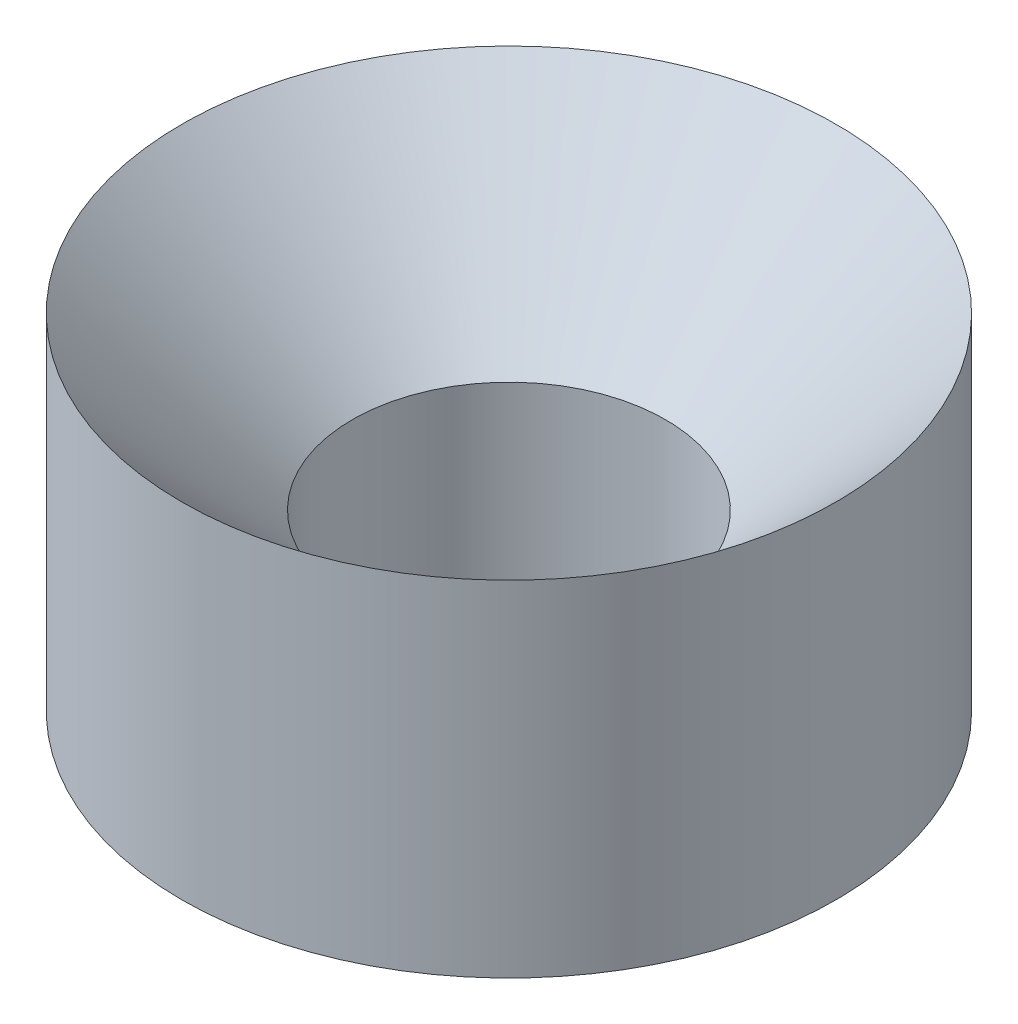
ISO-10303-21;
HEADER;
FILE_DESCRIPTION(('STEP AP214'),'2;1');
FILE_NAME('part.step','',(''),(''),'','','');
FILE_SCHEMA(('AUTOMOTIVE_DESIGN { 1 0 10303 214 1 1 1 1 }'));
ENDSEC;
DATA;
#1=APPLICATION_CONTEXT('core data for automotive mechanical design processes');
#2=APPLICATION_PROTOCOL_DEFINITION('international standard','automotive_design',2000,#1);
#3=PRODUCT_CONTEXT('',#1,'mechanical');
#4=PRODUCT('Part','Part','',(#3));
#5=PRODUCT_RELATED_PRODUCT_CATEGORY('part','',(#4));
#6=PRODUCT_DEFINITION_FORMATION('','',#4);
#7=PRODUCT_DEFINITION_CONTEXT('part definition',#1,'design');
#8=PRODUCT_DEFINITION('design','',#6,#7);
#9=PRODUCT_DEFINITION_SHAPE('','',#8);
#10=(LENGTH_UNIT() NAMED_UNIT(*) SI_UNIT(.MILLI.,.METRE.));
#11=(NAMED_UNIT(*) PLANE_ANGLE_UNIT() SI_UNIT($,.RADIAN.));
#12=(NAMED_UNIT(*) SI_UNIT($,.STERADIAN.) SOLID_ANGLE_UNIT());
#13=UNCERTAINTY_MEASURE_WITH_UNIT(LENGTH_MEASURE(1.E-05),#10,'distance_accuracy_value','');
#14=(GEOMETRIC_REPRESENTATION_CONTEXT(3) GLOBAL_UNCERTAINTY_ASSIGNED_CONTEXT((#13)) GLOBAL_UNIT_ASSIGNED_CONTEXT((#10,
#11,#12)) REPRESENTATION_CONTEXT('',''));
#15=CARTESIAN_POINT('',(0.,0.,0.));
#16=DIRECTION('',(0.,0.,1.));
#17=DIRECTION('',(1.,0.,0.));
#18=AXIS2_PLACEMENT_3D('',#15,#16,#17);
#19=CARTESIAN_POINT('',(0.,5.,0.));
#20=DIRECTION('',(0.,-1.,0.));
#21=DIRECTION('',(0.,0.,-1.));
#22=AXIS2_PLACEMENT_3D('',#19,#20,#21);
#23=CYLINDRICAL_SURFACE('',#22,4.7);
#24=CARTESIAN_POINT('',(0.,4.94999999999998,0.));
#25=DIRECTION('',(0.,1.,0.));
#26=DIRECTION('',(0.,0.,1.));
#27=AXIS2_PLACEMENT_3D('',#24,#25,#26);
#28=CIRCLE('',#27,4.7);
#29=CARTESIAN_POINT('',(0.,4.94999999999998,4.7));
#30=VERTEX_POINT('',#29);
#31=EDGE_CURVE('E10',#30,#30,#28,.F.);
#32=ORIENTED_EDGE('',*,*,#31,.T.);
#33=EDGE_LOOP('',(#32));
#34=FACE_BOUND('',#33,.T.);
#35=CARTESIAN_POINT('',(0.,0.,0.));
#36=DIRECTION('',(0.,1.,0.));
#37=DIRECTION('',(0.,0.,1.));
#38=AXIS2_PLACEMENT_3D('',#35,#36,#37);
#39=CIRCLE('',#38,4.7);
#40=CARTESIAN_POINT('',(0.,0.,4.7));
#41=VERTEX_POINT('',#40);
#42=EDGE_CURVE('E59',#41,#41,#39,.T.);
#43=ORIENTED_EDGE('',*,*,#42,.T.);
#44=EDGE_LOOP('',(#43));
#45=FACE_BOUND('',#44,.T.);
#46=ADVANCED_FACE('F45',(#34,#45),#23,.T.);
#47=CARTESIAN_POINT('',(0.,0.,0.));
#48=DIRECTION('',(0.,1.,0.));
#49=DIRECTION('',(0.,0.,1.));
#50=AXIS2_PLACEMENT_3D('',#47,#48,#49);
#51=PLANE('',#50);
#52=CARTESIAN_POINT('',(0.,0.,0.));
#53=DIRECTION('',(0.,1.,0.));
#54=DIRECTION('',(0.,0.,1.));
#55=AXIS2_PLACEMENT_3D('',#52,#53,#54);
#56=CIRCLE('',#55,2.25);
#57=CARTESIAN_POINT('',(0.,0.,2.25));
#58=VERTEX_POINT('',#57);
#59=EDGE_CURVE('E64',#58,#58,#56,.T.);
#60=ORIENTED_EDGE('',*,*,#59,.T.);
#61=EDGE_LOOP('',(#60));
#62=FACE_BOUND('',#61,.T.);
#63=ORIENTED_EDGE('',*,*,#42,.F.);
#64=EDGE_LOOP('',(#63));
#65=FACE_BOUND('',#64,.T.);
#66=ADVANCED_FACE('F71',(#62,#65),#51,.F.);
#67=CARTESIAN_POINT('',(0.,0.,0.));
#68=DIRECTION('',(0.,1.,0.));
#69=DIRECTION('',(0.,0.,1.));
#70=AXIS2_PLACEMENT_3D('',#67,#68,#69);
#71=CYLINDRICAL_SURFACE('',#70,2.25);
#72=CARTESIAN_POINT('',(0.,2.49999999999996,0.));
#73=DIRECTION('',(0.,1.,0.));
#74=DIRECTION('',(0.,0.,1.));
#75=AXIS2_PLACEMENT_3D('',#72,#73,#74);
#76=CIRCLE('',#75,2.25);
#77=CARTESIAN_POINT('',(0.,2.49999999999996,2.25));
#78=VERTEX_POINT('',#77);
#79=EDGE_CURVE('E54',#78,#78,#76,.T.);
#80=ORIENTED_EDGE('',*,*,#79,.T.);
#81=EDGE_LOOP('',(#80));
#82=FACE_BOUND('',#81,.T.);
#83=ORIENTED_EDGE('',*,*,#59,.F.);
#84=EDGE_LOOP('',(#83));
#85=FACE_BOUND('',#84,.T.);
#86=ADVANCED_FACE('F74',(#82,#85),#71,.F.);
#87=CARTESIAN_POINT('',(0.,2.49999999999996,0.));
#88=DIRECTION('',(0.,1.,0.));
#89=DIRECTION('',(0.,0.,1.));
#90=AXIS2_PLACEMENT_3D('',#87,#88,#89);
#91=CONICAL_SURFACE('',#90,2.25,0.785398163397443);
#92=ORIENTED_EDGE('',*,*,#31,.F.);
#93=EDGE_LOOP('',(#92));
#94=FACE_BOUND('',#93,.T.);
#95=ORIENTED_EDGE('',*,*,#79,.F.);
#96=EDGE_LOOP('',(#95));
#97=FACE_BOUND('',#96,.T.);
#98=ADVANCED_FACE('F48',(#94,#97),#91,.F.);
#99=CLOSED_SHELL('',(#46,#66,#86,#98));
#100=MANIFOLD_SOLID_BREP('B2',#99);
#101=ADVANCED_BREP_SHAPE_REPRESENTATION('',(#18,#100),#14);
#102=SHAPE_DEFINITION_REPRESENTATION(#9,#101);
ENDSEC;
END-ISO-10303-21;
